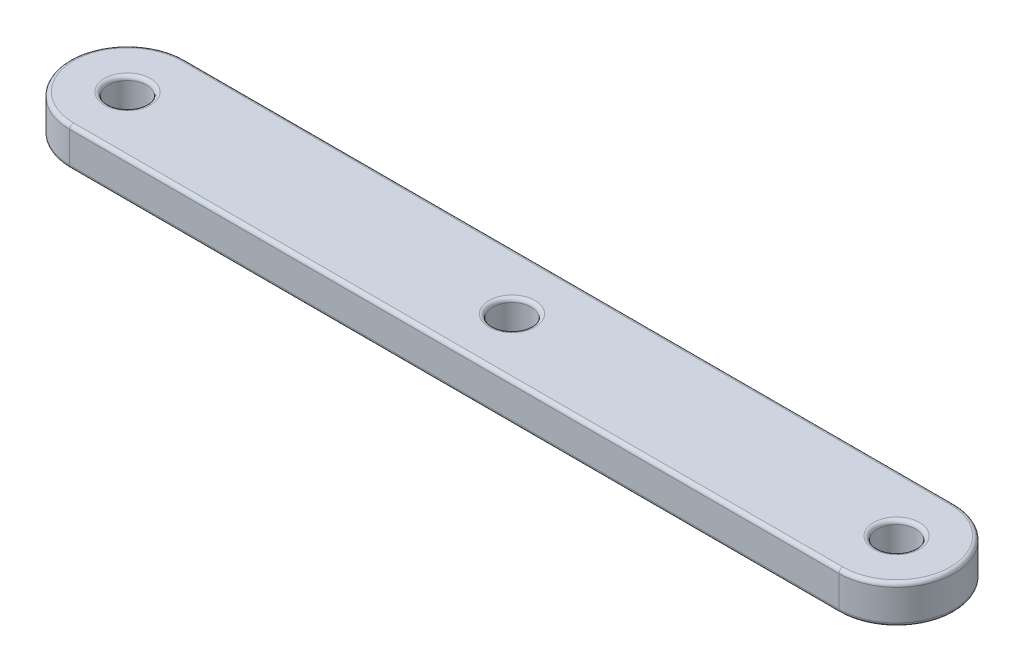
ISO-10303-21;
HEADER;
FILE_DESCRIPTION(('STEP AP214'),'2;1');
FILE_NAME('part.step','',(''),(''),'','','');
FILE_SCHEMA(('AUTOMOTIVE_DESIGN { 1 0 10303 214 1 1 1 1 }'));
ENDSEC;
DATA;
#1=APPLICATION_CONTEXT('core data for automotive mechanical design processes');
#2=APPLICATION_PROTOCOL_DEFINITION('international standard','automotive_design',2000,#1);
#3=PRODUCT_CONTEXT('',#1,'mechanical');
#4=PRODUCT('Part','Part','',(#3));
#5=PRODUCT_RELATED_PRODUCT_CATEGORY('part','',(#4));
#6=PRODUCT_DEFINITION_FORMATION('','',#4);
#7=PRODUCT_DEFINITION_CONTEXT('part definition',#1,'design');
#8=PRODUCT_DEFINITION('design','',#6,#7);
#9=PRODUCT_DEFINITION_SHAPE('','',#8);
#10=(LENGTH_UNIT() NAMED_UNIT(*) SI_UNIT(.MILLI.,.METRE.));
#11=(NAMED_UNIT(*) PLANE_ANGLE_UNIT() SI_UNIT($,.RADIAN.));
#12=(NAMED_UNIT(*) SI_UNIT($,.STERADIAN.) SOLID_ANGLE_UNIT());
#13=UNCERTAINTY_MEASURE_WITH_UNIT(LENGTH_MEASURE(1.E-05),#10,'distance_accuracy_value','');
#14=(GEOMETRIC_REPRESENTATION_CONTEXT(3) GLOBAL_UNCERTAINTY_ASSIGNED_CONTEXT((#13)) GLOBAL_UNIT_ASSIGNED_CONTEXT((#10,
#11,#12)) REPRESENTATION_CONTEXT('',''));
#15=CARTESIAN_POINT('',(0.,0.,0.));
#16=DIRECTION('',(0.,0.,1.));
#17=DIRECTION('',(1.,0.,0.));
#18=AXIS2_PLACEMENT_3D('',#15,#16,#17);
#19=CARTESIAN_POINT('',(0.,10.,0.));
#20=DIRECTION('',(0.,1.,0.));
#21=DIRECTION('',(0.,0.,1.));
#22=AXIS2_PLACEMENT_3D('',#19,#20,#21);
#23=PLANE('',#22);
#24=CARTESIAN_POINT('',(0.,10.,0.));
#25=DIRECTION('',(0.,1.,0.));
#26=DIRECTION('',(0.,0.,1.));
#27=AXIS2_PLACEMENT_3D('',#24,#25,#26);
#28=CIRCLE('',#27,6.);
#29=CARTESIAN_POINT('',(0.,10.,6.));
#30=VERTEX_POINT('',#29);
#31=EDGE_CURVE('E200',#30,#30,#28,.F.);
#32=ORIENTED_EDGE('',*,*,#31,.T.);
#33=EDGE_LOOP('',(#32));
#34=FACE_BOUND('',#33,.T.);
#35=CARTESIAN_POINT('',(200.,10.,0.));
#36=DIRECTION('',(0.,1.,0.));
#37=DIRECTION('',(0.,0.,1.));
#38=AXIS2_PLACEMENT_3D('',#35,#36,#37);
#39=CIRCLE('',#38,5.99999999999999);
#40=CARTESIAN_POINT('',(200.,10.,5.99999999999999));
#41=VERTEX_POINT('',#40);
#42=EDGE_CURVE('E197',#41,#41,#39,.F.);
#43=ORIENTED_EDGE('',*,*,#42,.T.);
#44=EDGE_LOOP('',(#43));
#45=FACE_BOUND('',#44,.T.);
#46=CARTESIAN_POINT('',(100.,10.,0.));
#47=DIRECTION('',(0.,1.,0.));
#48=DIRECTION('',(0.,0.,1.));
#49=AXIS2_PLACEMENT_3D('',#46,#47,#48);
#50=CIRCLE('',#49,6.);
#51=CARTESIAN_POINT('',(100.,10.,6.));
#52=VERTEX_POINT('',#51);
#53=EDGE_CURVE('E194',#52,#52,#50,.F.);
#54=ORIENTED_EDGE('',*,*,#53,.T.);
#55=EDGE_LOOP('',(#54));
#56=FACE_BOUND('',#55,.T.);
#57=CARTESIAN_POINT('',(200.,10.,0.));
#58=DIRECTION('',(0.,1.,0.));
#59=DIRECTION('',(0.,0.,1.));
#60=AXIS2_PLACEMENT_3D('',#57,#58,#59);
#61=CIRCLE('',#60,14.);
#62=CARTESIAN_POINT('',(200.,10.,14.));
#63=VERTEX_POINT('',#62);
#64=CARTESIAN_POINT('',(200.,10.,-14.));
#65=VERTEX_POINT('',#64);
#66=EDGE_CURVE('E130',#63,#65,#61,.T.);
#67=ORIENTED_EDGE('',*,*,#66,.T.);
#68=DIRECTION('',(-1.,0.,0.));
#69=VECTOR('',#68,1.);
#70=CARTESIAN_POINT('',(0.,10.,-14.));
#71=LINE('',#70,#69);
#72=CARTESIAN_POINT('',(0.,10.,-14.));
#73=VERTEX_POINT('',#72);
#74=EDGE_CURVE('E111',#65,#73,#71,.T.);
#75=ORIENTED_EDGE('',*,*,#74,.T.);
#76=CARTESIAN_POINT('',(0.,10.,0.));
#77=DIRECTION('',(0.,1.,0.));
#78=DIRECTION('',(0.,0.,1.));
#79=AXIS2_PLACEMENT_3D('',#76,#77,#78);
#80=CIRCLE('',#79,14.);
#81=CARTESIAN_POINT('',(0.,10.,14.));
#82=VERTEX_POINT('',#81);
#83=EDGE_CURVE('E120',#73,#82,#80,.T.);
#84=ORIENTED_EDGE('',*,*,#83,.T.);
#85=DIRECTION('',(1.,0.,0.));
#86=VECTOR('',#85,1.);
#87=CARTESIAN_POINT('',(200.,10.,14.));
#88=LINE('',#87,#86);
#89=EDGE_CURVE('E126',#82,#63,#88,.T.);
#90=ORIENTED_EDGE('',*,*,#89,.T.);
#91=EDGE_LOOP('',(#67,#75,#84,#90));
#92=FACE_BOUND('',#91,.T.);
#93=ADVANCED_FACE('F41',(#34,#45,#56,#92),#23,.T.);
#94=CARTESIAN_POINT('',(0.,0.,0.));
#95=DIRECTION('',(0.,1.,0.));
#96=DIRECTION('',(0.,0.,1.));
#97=AXIS2_PLACEMENT_3D('',#94,#95,#96);
#98=PLANE('',#97);
#99=CARTESIAN_POINT('',(0.,0.,0.));
#100=DIRECTION('',(0.,1.,0.));
#101=DIRECTION('',(0.,0.,1.));
#102=AXIS2_PLACEMENT_3D('',#99,#100,#101);
#103=CIRCLE('',#102,6.);
#104=CARTESIAN_POINT('',(0.,0.,6.));
#105=VERTEX_POINT('',#104);
#106=EDGE_CURVE('E164',#105,#105,#103,.T.);
#107=ORIENTED_EDGE('',*,*,#106,.T.);
#108=EDGE_LOOP('',(#107));
#109=FACE_BOUND('',#108,.T.);
#110=CARTESIAN_POINT('',(100.,0.,0.));
#111=DIRECTION('',(0.,1.,0.));
#112=DIRECTION('',(0.,0.,1.));
#113=AXIS2_PLACEMENT_3D('',#110,#111,#112);
#114=CIRCLE('',#113,6.);
#115=CARTESIAN_POINT('',(100.,0.,6.));
#116=VERTEX_POINT('',#115);
#117=EDGE_CURVE('E161',#116,#116,#114,.T.);
#118=ORIENTED_EDGE('',*,*,#117,.T.);
#119=EDGE_LOOP('',(#118));
#120=FACE_BOUND('',#119,.T.);
#121=CARTESIAN_POINT('',(200.,0.,0.));
#122=DIRECTION('',(0.,1.,0.));
#123=DIRECTION('',(0.,0.,1.));
#124=AXIS2_PLACEMENT_3D('',#121,#122,#123);
#125=CIRCLE('',#124,5.99999999999999);
#126=CARTESIAN_POINT('',(200.,0.,5.99999999999999));
#127=VERTEX_POINT('',#126);
#128=EDGE_CURVE('E158',#127,#127,#125,.T.);
#129=ORIENTED_EDGE('',*,*,#128,.T.);
#130=EDGE_LOOP('',(#129));
#131=FACE_BOUND('',#130,.T.);
#132=CARTESIAN_POINT('',(200.,0.,0.));
#133=DIRECTION('',(0.,1.,0.));
#134=DIRECTION('',(0.,0.,1.));
#135=AXIS2_PLACEMENT_3D('',#132,#133,#134);
#136=CIRCLE('',#135,14.);
#137=CARTESIAN_POINT('',(200.,0.,-14.));
#138=VERTEX_POINT('',#137);
#139=CARTESIAN_POINT('',(200.,0.,14.));
#140=VERTEX_POINT('',#139);
#141=EDGE_CURVE('E56',#138,#140,#136,.F.);
#142=ORIENTED_EDGE('',*,*,#141,.T.);
#143=DIRECTION('',(1.,0.,0.));
#144=VECTOR('',#143,1.);
#145=CARTESIAN_POINT('',(0.,0.,14.));
#146=LINE('',#145,#144);
#147=CARTESIAN_POINT('',(0.,0.,14.));
#148=VERTEX_POINT('',#147);
#149=EDGE_CURVE('E156',#140,#148,#146,.F.);
#150=ORIENTED_EDGE('',*,*,#149,.T.);
#151=CARTESIAN_POINT('',(0.,0.,0.));
#152=DIRECTION('',(0.,1.,0.));
#153=DIRECTION('',(0.,0.,1.));
#154=AXIS2_PLACEMENT_3D('',#151,#152,#153);
#155=CIRCLE('',#154,14.);
#156=CARTESIAN_POINT('',(0.,0.,-14.));
#157=VERTEX_POINT('',#156);
#158=EDGE_CURVE('E152',#148,#157,#155,.F.);
#159=ORIENTED_EDGE('',*,*,#158,.T.);
#160=DIRECTION('',(-1.,0.,0.));
#161=VECTOR('',#160,1.);
#162=CARTESIAN_POINT('',(0.,0.,-14.));
#163=LINE('',#162,#161);
#164=EDGE_CURVE('E61',#157,#138,#163,.F.);
#165=ORIENTED_EDGE('',*,*,#164,.T.);
#166=EDGE_LOOP('',(#142,#150,#159,#165));
#167=FACE_BOUND('',#166,.T.);
#168=ADVANCED_FACE('F222',(#109,#120,#131,#167),#98,.F.);
#169=CARTESIAN_POINT('',(0.,10.,0.));
#170=DIRECTION('',(0.,-1.,0.));
#171=DIRECTION('',(0.,0.,-1.));
#172=AXIS2_PLACEMENT_3D('',#169,#170,#171);
#173=CYLINDRICAL_SURFACE('',#172,15.);
#174=DIRECTION('',(0.,-1.,0.));
#175=VECTOR('',#174,1.);
#176=CARTESIAN_POINT('',(0.,10.,15.));
#177=LINE('',#176,#175);
#178=CARTESIAN_POINT('',(0.,9.,15.));
#179=VERTEX_POINT('',#178);
#180=CARTESIAN_POINT('',(0.,0.999999999999999,15.));
#181=VERTEX_POINT('',#180);
#182=EDGE_CURVE('E127',#179,#181,#177,.T.);
#183=ORIENTED_EDGE('',*,*,#182,.F.);
#184=CARTESIAN_POINT('',(0.,9.,0.));
#185=DIRECTION('',(0.,1.,0.));
#186=DIRECTION('',(0.,0.,1.));
#187=AXIS2_PLACEMENT_3D('',#184,#185,#186);
#188=CIRCLE('',#187,15.);
#189=CARTESIAN_POINT('',(0.,9.,-15.));
#190=VERTEX_POINT('',#189);
#191=EDGE_CURVE('E150',#179,#190,#188,.F.);
#192=ORIENTED_EDGE('',*,*,#191,.T.);
#193=DIRECTION('',(0.,-1.,0.));
#194=VECTOR('',#193,1.);
#195=CARTESIAN_POINT('',(0.,10.,-15.));
#196=LINE('',#195,#194);
#197=CARTESIAN_POINT('',(0.,0.999999999999999,-15.));
#198=VERTEX_POINT('',#197);
#199=EDGE_CURVE('E182',#190,#198,#196,.T.);
#200=ORIENTED_EDGE('',*,*,#199,.T.);
#201=CARTESIAN_POINT('',(0.,0.999999999999999,0.));
#202=DIRECTION('',(0.,1.,0.));
#203=DIRECTION('',(0.,0.,1.));
#204=AXIS2_PLACEMENT_3D('',#201,#202,#203);
#205=CIRCLE('',#204,15.);
#206=EDGE_CURVE('E148',#198,#181,#205,.T.);
#207=ORIENTED_EDGE('',*,*,#206,.T.);
#208=EDGE_LOOP('',(#183,#192,#200,#207));
#209=FACE_BOUND('',#208,.T.);
#210=ADVANCED_FACE('F230',(#209),#173,.T.);
#211=CARTESIAN_POINT('',(0.,10.,15.));
#212=DIRECTION('',(0.,0.,-1.));
#213=DIRECTION('',(-1.,0.,0.));
#214=AXIS2_PLACEMENT_3D('',#211,#212,#213);
#215=PLANE('',#214);
#216=DIRECTION('',(0.,-1.,0.));
#217=VECTOR('',#216,1.);
#218=CARTESIAN_POINT('',(200.,10.,15.));
#219=LINE('',#218,#217);
#220=CARTESIAN_POINT('',(200.,9.,15.));
#221=VERTEX_POINT('',#220);
#222=CARTESIAN_POINT('',(200.,0.999999999999999,15.));
#223=VERTEX_POINT('',#222);
#224=EDGE_CURVE('E307',#221,#223,#219,.T.);
#225=ORIENTED_EDGE('',*,*,#224,.F.);
#226=DIRECTION('',(1.,0.,0.));
#227=VECTOR('',#226,1.);
#228=CARTESIAN_POINT('',(0.,9.,15.));
#229=LINE('',#228,#227);
#230=EDGE_CURVE('E146',#221,#179,#229,.F.);
#231=ORIENTED_EDGE('',*,*,#230,.T.);
#232=ORIENTED_EDGE('',*,*,#182,.T.);
#233=DIRECTION('',(1.,0.,0.));
#234=VECTOR('',#233,1.);
#235=CARTESIAN_POINT('',(0.,0.999999999999999,15.));
#236=LINE('',#235,#234);
#237=EDGE_CURVE('E143',#181,#223,#236,.T.);
#238=ORIENTED_EDGE('',*,*,#237,.T.);
#239=EDGE_LOOP('',(#225,#231,#232,#238));
#240=FACE_BOUND('',#239,.T.);
#241=ADVANCED_FACE('F244',(#240),#215,.F.);
#242=CARTESIAN_POINT('',(200.,10.,0.));
#243=DIRECTION('',(0.,-1.,0.));
#244=DIRECTION('',(0.,0.,-1.));
#245=AXIS2_PLACEMENT_3D('',#242,#243,#244);
#246=CYLINDRICAL_SURFACE('',#245,15.);
#247=DIRECTION('',(0.,-1.,0.));
#248=VECTOR('',#247,1.);
#249=CARTESIAN_POINT('',(200.,10.,-15.));
#250=LINE('',#249,#248);
#251=CARTESIAN_POINT('',(200.,9.,-15.));
#252=VERTEX_POINT('',#251);
#253=CARTESIAN_POINT('',(200.,0.999999999999999,-15.));
#254=VERTEX_POINT('',#253);
#255=EDGE_CURVE('E309',#252,#254,#250,.T.);
#256=ORIENTED_EDGE('',*,*,#255,.F.);
#257=CARTESIAN_POINT('',(200.,9.,0.));
#258=DIRECTION('',(0.,1.,0.));
#259=DIRECTION('',(0.,0.,1.));
#260=AXIS2_PLACEMENT_3D('',#257,#258,#259);
#261=CIRCLE('',#260,15.);
#262=EDGE_CURVE('E141',#252,#221,#261,.F.);
#263=ORIENTED_EDGE('',*,*,#262,.T.);
#264=ORIENTED_EDGE('',*,*,#224,.T.);
#265=CARTESIAN_POINT('',(200.,0.999999999999999,0.));
#266=DIRECTION('',(0.,1.,0.));
#267=DIRECTION('',(0.,0.,1.));
#268=AXIS2_PLACEMENT_3D('',#265,#266,#267);
#269=CIRCLE('',#268,15.);
#270=EDGE_CURVE('E139',#223,#254,#269,.T.);
#271=ORIENTED_EDGE('',*,*,#270,.T.);
#272=EDGE_LOOP('',(#256,#263,#264,#271));
#273=FACE_BOUND('',#272,.T.);
#274=ADVANCED_FACE('F240',(#273),#246,.T.);
#275=CARTESIAN_POINT('',(0.,10.,-15.));
#276=DIRECTION('',(0.,0.,1.));
#277=DIRECTION('',(1.,0.,0.));
#278=AXIS2_PLACEMENT_3D('',#275,#276,#277);
#279=PLANE('',#278);
#280=ORIENTED_EDGE('',*,*,#199,.F.);
#281=DIRECTION('',(-1.,0.,0.));
#282=VECTOR('',#281,1.);
#283=CARTESIAN_POINT('',(200.,9.,-15.));
#284=LINE('',#283,#282);
#285=EDGE_CURVE('E113',#190,#252,#284,.F.);
#286=ORIENTED_EDGE('',*,*,#285,.T.);
#287=ORIENTED_EDGE('',*,*,#255,.T.);
#288=DIRECTION('',(-1.,0.,0.));
#289=VECTOR('',#288,1.);
#290=CARTESIAN_POINT('',(0.,0.999999999999999,-15.));
#291=LINE('',#290,#289);
#292=EDGE_CURVE('E132',#254,#198,#291,.T.);
#293=ORIENTED_EDGE('',*,*,#292,.T.);
#294=EDGE_LOOP('',(#280,#286,#287,#293));
#295=FACE_BOUND('',#294,.T.);
#296=ADVANCED_FACE('F237',(#295),#279,.F.);
#297=CARTESIAN_POINT('',(200.,10.,0.));
#298=DIRECTION('',(0.,-1.,0.));
#299=DIRECTION('',(0.,0.,-1.));
#300=AXIS2_PLACEMENT_3D('',#297,#298,#299);
#301=CYLINDRICAL_SURFACE('',#300,4.99999999999999);
#302=CARTESIAN_POINT('',(200.,9.,0.));
#303=DIRECTION('',(0.,1.,0.));
#304=DIRECTION('',(0.,0.,1.));
#305=AXIS2_PLACEMENT_3D('',#302,#303,#304);
#306=CIRCLE('',#305,4.99999999999999);
#307=CARTESIAN_POINT('',(200.,9.,4.99999999999999));
#308=VERTEX_POINT('',#307);
#309=EDGE_CURVE('E49',#308,#308,#306,.T.);
#310=ORIENTED_EDGE('',*,*,#309,.T.);
#311=EDGE_LOOP('',(#310));
#312=FACE_BOUND('',#311,.T.);
#313=CARTESIAN_POINT('',(200.,0.999999999999999,0.));
#314=DIRECTION('',(0.,1.,0.));
#315=DIRECTION('',(0.,0.,1.));
#316=AXIS2_PLACEMENT_3D('',#313,#314,#315);
#317=CIRCLE('',#316,4.99999999999999);
#318=CARTESIAN_POINT('',(200.,0.999999999999999,4.99999999999999));
#319=VERTEX_POINT('',#318);
#320=EDGE_CURVE('E173',#319,#319,#317,.F.);
#321=ORIENTED_EDGE('',*,*,#320,.T.);
#322=EDGE_LOOP('',(#321));
#323=FACE_BOUND('',#322,.T.);
#324=ADVANCED_FACE('F205',(#312,#323),#301,.F.);
#325=CARTESIAN_POINT('',(100.,10.,0.));
#326=DIRECTION('',(0.,-1.,0.));
#327=DIRECTION('',(0.,0.,-1.));
#328=AXIS2_PLACEMENT_3D('',#325,#326,#327);
#329=CYLINDRICAL_SURFACE('',#328,5.);
#330=CARTESIAN_POINT('',(100.,9.,0.));
#331=DIRECTION('',(0.,1.,0.));
#332=DIRECTION('',(0.,0.,1.));
#333=AXIS2_PLACEMENT_3D('',#330,#331,#332);
#334=CIRCLE('',#333,5.);
#335=CARTESIAN_POINT('',(100.,9.,5.));
#336=VERTEX_POINT('',#335);
#337=EDGE_CURVE('E11',#336,#336,#334,.T.);
#338=ORIENTED_EDGE('',*,*,#337,.T.);
#339=EDGE_LOOP('',(#338));
#340=FACE_BOUND('',#339,.T.);
#341=CARTESIAN_POINT('',(100.,0.999999999999999,0.));
#342=DIRECTION('',(0.,1.,0.));
#343=DIRECTION('',(0.,0.,1.));
#344=AXIS2_PLACEMENT_3D('',#341,#342,#343);
#345=CIRCLE('',#344,5.);
#346=CARTESIAN_POINT('',(100.,0.999999999999999,5.));
#347=VERTEX_POINT('',#346);
#348=EDGE_CURVE('E170',#347,#347,#345,.F.);
#349=ORIENTED_EDGE('',*,*,#348,.T.);
#350=EDGE_LOOP('',(#349));
#351=FACE_BOUND('',#350,.T.);
#352=ADVANCED_FACE('F358',(#340,#351),#329,.F.);
#353=CARTESIAN_POINT('',(0.,10.,0.));
#354=DIRECTION('',(0.,-1.,0.));
#355=DIRECTION('',(0.,0.,-1.));
#356=AXIS2_PLACEMENT_3D('',#353,#354,#355);
#357=CYLINDRICAL_SURFACE('',#356,5.);
#358=CARTESIAN_POINT('',(0.,9.,0.));
#359=DIRECTION('',(0.,1.,0.));
#360=DIRECTION('',(0.,0.,1.));
#361=AXIS2_PLACEMENT_3D('',#358,#359,#360);
#362=CIRCLE('',#361,5.);
#363=CARTESIAN_POINT('',(0.,9.,5.));
#364=VERTEX_POINT('',#363);
#365=EDGE_CURVE('E175',#364,#364,#362,.T.);
#366=ORIENTED_EDGE('',*,*,#365,.T.);
#367=EDGE_LOOP('',(#366));
#368=FACE_BOUND('',#367,.T.);
#369=CARTESIAN_POINT('',(0.,0.999999999999999,0.));
#370=DIRECTION('',(0.,1.,0.));
#371=DIRECTION('',(0.,0.,1.));
#372=AXIS2_PLACEMENT_3D('',#369,#370,#371);
#373=CIRCLE('',#372,5.);
#374=CARTESIAN_POINT('',(0.,0.999999999999999,5.));
#375=VERTEX_POINT('',#374);
#376=EDGE_CURVE('E167',#375,#375,#373,.F.);
#377=ORIENTED_EDGE('',*,*,#376,.T.);
#378=EDGE_LOOP('',(#377));
#379=FACE_BOUND('',#378,.T.);
#380=ADVANCED_FACE('F264',(#368,#379),#357,.F.);
#381=CARTESIAN_POINT('',(0.,9.,14.));
#382=DIRECTION('',(-1.,0.,0.));
#383=DIRECTION('',(0.,0.,1.));
#384=AXIS2_PLACEMENT_3D('',#381,#382,#383);
#385=CYLINDRICAL_SURFACE('',#384,1.);
#386=CARTESIAN_POINT('',(0.,9.,14.));
#387=DIRECTION('',(-1.,0.,0.));
#388=DIRECTION('',(0.,0.,1.));
#389=AXIS2_PLACEMENT_3D('',#386,#387,#388);
#390=CIRCLE('',#389,1.);
#391=EDGE_CURVE('E123',#179,#82,#390,.T.);
#392=ORIENTED_EDGE('',*,*,#391,.F.);
#393=ORIENTED_EDGE('',*,*,#230,.F.);
#394=CARTESIAN_POINT('',(200.,9.,14.));
#395=DIRECTION('',(1.,0.,0.));
#396=DIRECTION('',(0.,0.,-1.));
#397=AXIS2_PLACEMENT_3D('',#394,#395,#396);
#398=CIRCLE('',#397,1.);
#399=EDGE_CURVE('E179',#63,#221,#398,.T.);
#400=ORIENTED_EDGE('',*,*,#399,.F.);
#401=ORIENTED_EDGE('',*,*,#89,.F.);
#402=EDGE_LOOP('',(#392,#393,#400,#401));
#403=FACE_BOUND('',#402,.T.);
#404=ADVANCED_FACE('F260',(#403),#385,.T.);
#405=CARTESIAN_POINT('',(200.,9.,0.));
#406=DIRECTION('',(0.,1.,0.));
#407=DIRECTION('',(0.,0.,1.));
#408=AXIS2_PLACEMENT_3D('',#405,#406,#407);
#409=TOROIDAL_SURFACE('',#408,14.,1.);
#410=ORIENTED_EDGE('',*,*,#399,.T.);
#411=ORIENTED_EDGE('',*,*,#262,.F.);
#412=CARTESIAN_POINT('',(200.,9.,-14.));
#413=DIRECTION('',(-1.,0.,0.));
#414=DIRECTION('',(0.,0.,1.));
#415=AXIS2_PLACEMENT_3D('',#412,#413,#414);
#416=CIRCLE('',#415,1.);
#417=EDGE_CURVE('E116',#65,#252,#416,.T.);
#418=ORIENTED_EDGE('',*,*,#417,.F.);
#419=ORIENTED_EDGE('',*,*,#66,.F.);
#420=EDGE_LOOP('',(#410,#411,#418,#419));
#421=FACE_BOUND('',#420,.T.);
#422=ADVANCED_FACE('F257',(#421),#409,.T.);
#423=CARTESIAN_POINT('',(0.,9.,0.));
#424=DIRECTION('',(0.,1.,0.));
#425=DIRECTION('',(0.,0.,1.));
#426=AXIS2_PLACEMENT_3D('',#423,#424,#425);
#427=TOROIDAL_SURFACE('',#426,14.,1.);
#428=ORIENTED_EDGE('',*,*,#391,.T.);
#429=ORIENTED_EDGE('',*,*,#83,.F.);
#430=CARTESIAN_POINT('',(0.,9.,-14.));
#431=DIRECTION('',(1.,0.,0.));
#432=DIRECTION('',(0.,0.,-1.));
#433=AXIS2_PLACEMENT_3D('',#430,#431,#432);
#434=CIRCLE('',#433,1.);
#435=EDGE_CURVE('E107',#190,#73,#434,.T.);
#436=ORIENTED_EDGE('',*,*,#435,.F.);
#437=ORIENTED_EDGE('',*,*,#191,.F.);
#438=EDGE_LOOP('',(#428,#429,#436,#437));
#439=FACE_BOUND('',#438,.T.);
#440=ADVANCED_FACE('F121',(#439),#427,.T.);
#441=CARTESIAN_POINT('',(0.,9.,-14.));
#442=DIRECTION('',(1.,0.,0.));
#443=DIRECTION('',(0.,0.,-1.));
#444=AXIS2_PLACEMENT_3D('',#441,#442,#443);
#445=CYLINDRICAL_SURFACE('',#444,1.);
#446=ORIENTED_EDGE('',*,*,#417,.T.);
#447=ORIENTED_EDGE('',*,*,#285,.F.);
#448=ORIENTED_EDGE('',*,*,#435,.T.);
#449=ORIENTED_EDGE('',*,*,#74,.F.);
#450=EDGE_LOOP('',(#446,#447,#448,#449));
#451=FACE_BOUND('',#450,.T.);
#452=ADVANCED_FACE('F109',(#451),#445,.T.);
#453=CARTESIAN_POINT('',(0.,0.999999999999999,0.));
#454=DIRECTION('',(0.,1.,0.));
#455=DIRECTION('',(0.,0.,1.));
#456=AXIS2_PLACEMENT_3D('',#453,#454,#455);
#457=TOROIDAL_SURFACE('',#456,6.,1.);
#458=ORIENTED_EDGE('',*,*,#376,.F.);
#459=EDGE_LOOP('',(#458));
#460=FACE_BOUND('',#459,.T.);
#461=ORIENTED_EDGE('',*,*,#106,.F.);
#462=EDGE_LOOP('',(#461));
#463=FACE_BOUND('',#462,.T.);
#464=ADVANCED_FACE('F254',(#460,#463),#457,.T.);
#465=CARTESIAN_POINT('',(100.,0.999999999999999,0.));
#466=DIRECTION('',(0.,1.,0.));
#467=DIRECTION('',(0.,0.,1.));
#468=AXIS2_PLACEMENT_3D('',#465,#466,#467);
#469=TOROIDAL_SURFACE('',#468,6.,1.);
#470=ORIENTED_EDGE('',*,*,#348,.F.);
#471=EDGE_LOOP('',(#470));
#472=FACE_BOUND('',#471,.T.);
#473=ORIENTED_EDGE('',*,*,#117,.F.);
#474=EDGE_LOOP('',(#473));
#475=FACE_BOUND('',#474,.T.);
#476=ADVANCED_FACE('F268',(#472,#475),#469,.T.);
#477=CARTESIAN_POINT('',(200.,0.999999999999999,0.));
#478=DIRECTION('',(0.,1.,0.));
#479=DIRECTION('',(0.,0.,1.));
#480=AXIS2_PLACEMENT_3D('',#477,#478,#479);
#481=TOROIDAL_SURFACE('',#480,5.99999999999999,1.);
#482=ORIENTED_EDGE('',*,*,#320,.F.);
#483=EDGE_LOOP('',(#482));
#484=FACE_BOUND('',#483,.T.);
#485=ORIENTED_EDGE('',*,*,#128,.F.);
#486=EDGE_LOOP('',(#485));
#487=FACE_BOUND('',#486,.T.);
#488=ADVANCED_FACE('F272',(#484,#487),#481,.T.);
#489=CARTESIAN_POINT('',(0.,0.999999999999999,-14.));
#490=DIRECTION('',(-1.,0.,0.));
#491=DIRECTION('',(0.,0.,1.));
#492=AXIS2_PLACEMENT_3D('',#489,#490,#491);
#493=CYLINDRICAL_SURFACE('',#492,1.);
#494=CARTESIAN_POINT('',(200.,1.,-14.));
#495=DIRECTION('',(1.,0.,0.));
#496=DIRECTION('',(0.,0.,-1.));
#497=AXIS2_PLACEMENT_3D('',#494,#495,#496);
#498=CIRCLE('',#497,1.);
#499=EDGE_CURVE('E187',#138,#254,#498,.T.);
#500=ORIENTED_EDGE('',*,*,#499,.F.);
#501=ORIENTED_EDGE('',*,*,#164,.F.);
#502=CARTESIAN_POINT('',(0.,0.999999999999999,-14.));
#503=DIRECTION('',(-1.,0.,0.));
#504=DIRECTION('',(0.,0.,1.));
#505=AXIS2_PLACEMENT_3D('',#502,#503,#504);
#506=CIRCLE('',#505,1.);
#507=EDGE_CURVE('E117',#198,#157,#506,.T.);
#508=ORIENTED_EDGE('',*,*,#507,.F.);
#509=ORIENTED_EDGE('',*,*,#292,.F.);
#510=EDGE_LOOP('',(#500,#501,#508,#509));
#511=FACE_BOUND('',#510,.T.);
#512=ADVANCED_FACE('F276',(#511),#493,.T.);
#513=CARTESIAN_POINT('',(0.,0.999999999999999,0.));
#514=DIRECTION('',(0.,1.,0.));
#515=DIRECTION('',(0.,0.,1.));
#516=AXIS2_PLACEMENT_3D('',#513,#514,#515);
#517=TOROIDAL_SURFACE('',#516,14.,1.);
#518=ORIENTED_EDGE('',*,*,#507,.T.);
#519=ORIENTED_EDGE('',*,*,#158,.F.);
#520=CARTESIAN_POINT('',(0.,0.999999999999999,14.));
#521=DIRECTION('',(1.,0.,0.));
#522=DIRECTION('',(0.,0.,-1.));
#523=AXIS2_PLACEMENT_3D('',#520,#521,#522);
#524=CIRCLE('',#523,1.);
#525=EDGE_CURVE('E185',#181,#148,#524,.T.);
#526=ORIENTED_EDGE('',*,*,#525,.F.);
#527=ORIENTED_EDGE('',*,*,#206,.F.);
#528=EDGE_LOOP('',(#518,#519,#526,#527));
#529=FACE_BOUND('',#528,.T.);
#530=ADVANCED_FACE('F283',(#529),#517,.T.);
#531=CARTESIAN_POINT('',(200.,0.999999999999999,0.));
#532=DIRECTION('',(0.,1.,0.));
#533=DIRECTION('',(0.,0.,1.));
#534=AXIS2_PLACEMENT_3D('',#531,#532,#533);
#535=TOROIDAL_SURFACE('',#534,14.,1.);
#536=ORIENTED_EDGE('',*,*,#499,.T.);
#537=ORIENTED_EDGE('',*,*,#270,.F.);
#538=CARTESIAN_POINT('',(200.,1.,14.));
#539=DIRECTION('',(-1.,0.,0.));
#540=DIRECTION('',(0.,0.,1.));
#541=AXIS2_PLACEMENT_3D('',#538,#539,#540);
#542=CIRCLE('',#541,1.);
#543=EDGE_CURVE('E183',#140,#223,#542,.T.);
#544=ORIENTED_EDGE('',*,*,#543,.F.);
#545=ORIENTED_EDGE('',*,*,#141,.F.);
#546=EDGE_LOOP('',(#536,#537,#544,#545));
#547=FACE_BOUND('',#546,.T.);
#548=ADVANCED_FACE('F279',(#547),#535,.T.);
#549=CARTESIAN_POINT('',(0.,0.999999999999999,14.));
#550=DIRECTION('',(1.,0.,0.));
#551=DIRECTION('',(0.,0.,-1.));
#552=AXIS2_PLACEMENT_3D('',#549,#550,#551);
#553=CYLINDRICAL_SURFACE('',#552,1.);
#554=ORIENTED_EDGE('',*,*,#525,.T.);
#555=ORIENTED_EDGE('',*,*,#149,.F.);
#556=ORIENTED_EDGE('',*,*,#543,.T.);
#557=ORIENTED_EDGE('',*,*,#237,.F.);
#558=EDGE_LOOP('',(#554,#555,#556,#557));
#559=FACE_BOUND('',#558,.T.);
#560=ADVANCED_FACE('F217',(#559),#553,.T.);
#561=CARTESIAN_POINT('',(0.,9.,0.));
#562=DIRECTION('',(0.,1.,0.));
#563=DIRECTION('',(0.,0.,1.));
#564=AXIS2_PLACEMENT_3D('',#561,#562,#563);
#565=TOROIDAL_SURFACE('',#564,6.,1.);
#566=ORIENTED_EDGE('',*,*,#31,.F.);
#567=EDGE_LOOP('',(#566));
#568=FACE_BOUND('',#567,.T.);
#569=ORIENTED_EDGE('',*,*,#365,.F.);
#570=EDGE_LOOP('',(#569));
#571=FACE_BOUND('',#570,.T.);
#572=ADVANCED_FACE('F210',(#568,#571),#565,.T.);
#573=CARTESIAN_POINT('',(200.,9.,0.));
#574=DIRECTION('',(0.,1.,0.));
#575=DIRECTION('',(0.,0.,1.));
#576=AXIS2_PLACEMENT_3D('',#573,#574,#575);
#577=TOROIDAL_SURFACE('',#576,5.99999999999999,1.);
#578=ORIENTED_EDGE('',*,*,#42,.F.);
#579=EDGE_LOOP('',(#578));
#580=FACE_BOUND('',#579,.T.);
#581=ORIENTED_EDGE('',*,*,#309,.F.);
#582=EDGE_LOOP('',(#581));
#583=FACE_BOUND('',#582,.T.);
#584=ADVANCED_FACE('F208',(#580,#583),#577,.T.);
#585=CARTESIAN_POINT('',(100.,9.,0.));
#586=DIRECTION('',(0.,1.,0.));
#587=DIRECTION('',(0.,0.,1.));
#588=AXIS2_PLACEMENT_3D('',#585,#586,#587);
#589=TOROIDAL_SURFACE('',#588,6.,1.);
#590=ORIENTED_EDGE('',*,*,#53,.F.);
#591=EDGE_LOOP('',(#590));
#592=FACE_BOUND('',#591,.T.);
#593=ORIENTED_EDGE('',*,*,#337,.F.);
#594=EDGE_LOOP('',(#593));
#595=FACE_BOUND('',#594,.T.);
#596=ADVANCED_FACE('F43',(#592,#595),#589,.T.);
#597=CLOSED_SHELL('',(#93,#168,#210,#241,#274,#296,#324,#352,#380,#404,#422,#440,#452,#464,#476,
#488,#512,#530,#548,#560,#572,#584,#596));
#598=MANIFOLD_SOLID_BREP('B2',#597);
#599=ADVANCED_BREP_SHAPE_REPRESENTATION('',(#18,#598),#14);
#600=SHAPE_DEFINITION_REPRESENTATION(#9,#599);
ENDSEC;
END-ISO-10303-21;
